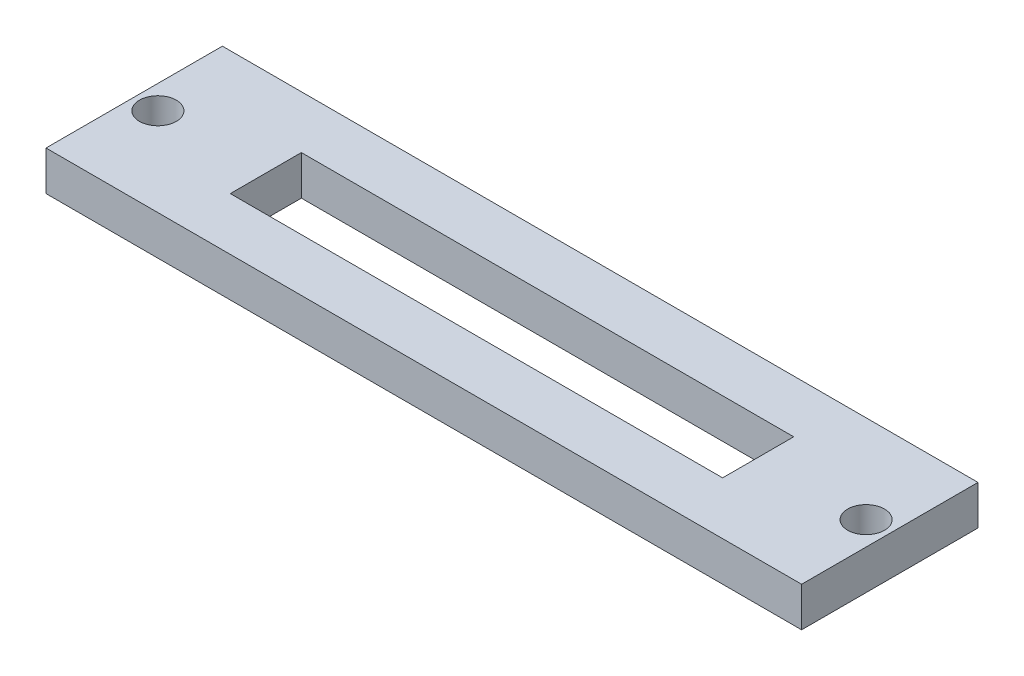
ISO-10303-21;
HEADER;
FILE_DESCRIPTION(('STEP AP214'),'2;1');
FILE_NAME('part.step','',(''),(''),'','','');
FILE_SCHEMA(('AUTOMOTIVE_DESIGN { 1 0 10303 214 1 1 1 1 }'));
ENDSEC;
DATA;
#1=APPLICATION_CONTEXT('core data for automotive mechanical design processes');
#2=APPLICATION_PROTOCOL_DEFINITION('international standard','automotive_design',2000,#1);
#3=PRODUCT_CONTEXT('',#1,'mechanical');
#4=PRODUCT('Part','Part','',(#3));
#5=PRODUCT_RELATED_PRODUCT_CATEGORY('part','',(#4));
#6=PRODUCT_DEFINITION_FORMATION('','',#4);
#7=PRODUCT_DEFINITION_CONTEXT('part definition',#1,'design');
#8=PRODUCT_DEFINITION('design','',#6,#7);
#9=PRODUCT_DEFINITION_SHAPE('','',#8);
#10=(LENGTH_UNIT() NAMED_UNIT(*) SI_UNIT(.MILLI.,.METRE.));
#11=(NAMED_UNIT(*) PLANE_ANGLE_UNIT() SI_UNIT($,.RADIAN.));
#12=(NAMED_UNIT(*) SI_UNIT($,.STERADIAN.) SOLID_ANGLE_UNIT());
#13=UNCERTAINTY_MEASURE_WITH_UNIT(LENGTH_MEASURE(1.E-05),#10,'distance_accuracy_value','');
#14=(GEOMETRIC_REPRESENTATION_CONTEXT(3) GLOBAL_UNCERTAINTY_ASSIGNED_CONTEXT((#13)) GLOBAL_UNIT_ASSIGNED_CONTEXT((#10,
#11,#12)) REPRESENTATION_CONTEXT('',''));
#15=CARTESIAN_POINT('',(0.,0.,0.));
#16=DIRECTION('',(0.,0.,1.));
#17=DIRECTION('',(1.,0.,0.));
#18=AXIS2_PLACEMENT_3D('',#15,#16,#17);
#19=CARTESIAN_POINT('',(0.,18.,0.));
#20=DIRECTION('',(0.,1.,0.));
#21=DIRECTION('',(0.,0.,1.));
#22=AXIS2_PLACEMENT_3D('',#19,#20,#21);
#23=PLANE('',#22);
#24=CARTESIAN_POINT('',(-26.9,18.,-24.6));
#25=DIRECTION('',(0.,1.,0.));
#26=DIRECTION('',(0.,0.,1.));
#27=AXIS2_PLACEMENT_3D('',#24,#25,#26);
#28=CIRCLE('',#27,1.4);
#29=CARTESIAN_POINT('',(-26.9,18.,-23.2));
#30=VERTEX_POINT('',#29);
#31=EDGE_CURVE('E131',#30,#30,#28,.T.);
#32=ORIENTED_EDGE('',*,*,#31,.F.);
#33=EDGE_LOOP('',(#32));
#34=FACE_BOUND('',#33,.T.);
#35=DIRECTION('',(0.,0.,1.));
#36=VECTOR('',#35,1.);
#37=CARTESIAN_POINT('',(-28.7,18.,-31.3));
#38=LINE('',#37,#36);
#39=CARTESIAN_POINT('',(-28.7,18.,-31.3));
#40=VERTEX_POINT('',#39);
#41=CARTESIAN_POINT('',(-28.7,18.,-17.9));
#42=VERTEX_POINT('',#41);
#43=EDGE_CURVE('E141',#40,#42,#38,.T.);
#44=ORIENTED_EDGE('',*,*,#43,.T.);
#45=DIRECTION('',(1.,0.,0.));
#46=VECTOR('',#45,1.);
#47=CARTESIAN_POINT('',(-28.7,18.,-17.9));
#48=LINE('',#47,#46);
#49=CARTESIAN_POINT('',(28.7,18.,-17.9));
#50=VERTEX_POINT('',#49);
#51=EDGE_CURVE('E144',#42,#50,#48,.T.);
#52=ORIENTED_EDGE('',*,*,#51,.T.);
#53=DIRECTION('',(0.,0.,-1.));
#54=VECTOR('',#53,1.);
#55=CARTESIAN_POINT('',(28.7,18.,-31.3));
#56=LINE('',#55,#54);
#57=CARTESIAN_POINT('',(28.7,18.,-31.3));
#58=VERTEX_POINT('',#57);
#59=EDGE_CURVE('E147',#50,#58,#56,.T.);
#60=ORIENTED_EDGE('',*,*,#59,.T.);
#61=DIRECTION('',(-1.,0.,0.));
#62=VECTOR('',#61,1.);
#63=CARTESIAN_POINT('',(-28.7,18.,-31.3));
#64=LINE('',#63,#62);
#65=EDGE_CURVE('E149',#58,#40,#64,.T.);
#66=ORIENTED_EDGE('',*,*,#65,.T.);
#67=EDGE_LOOP('',(#44,#52,#60,#66));
#68=FACE_BOUND('',#67,.T.);
#69=DIRECTION('',(1.,0.,0.));
#70=VECTOR('',#69,1.);
#71=CARTESIAN_POINT('',(-18.7,18.,-21.9));
#72=LINE('',#71,#70);
#73=CARTESIAN_POINT('',(-18.7,18.,-21.9));
#74=VERTEX_POINT('',#73);
#75=CARTESIAN_POINT('',(18.7,18.,-21.9));
#76=VERTEX_POINT('',#75);
#77=EDGE_CURVE('E110',#74,#76,#72,.T.);
#78=ORIENTED_EDGE('',*,*,#77,.F.);
#79=DIRECTION('',(0.,0.,1.));
#80=VECTOR('',#79,1.);
#81=CARTESIAN_POINT('',(-18.7,18.,-27.3));
#82=LINE('',#81,#80);
#83=CARTESIAN_POINT('',(-18.7,18.,-27.3));
#84=VERTEX_POINT('',#83);
#85=EDGE_CURVE('E102',#84,#74,#82,.T.);
#86=ORIENTED_EDGE('',*,*,#85,.F.);
#87=DIRECTION('',(-1.,0.,0.));
#88=VECTOR('',#87,1.);
#89=CARTESIAN_POINT('',(-18.7,18.,-27.3));
#90=LINE('',#89,#88);
#91=CARTESIAN_POINT('',(18.7,18.,-27.3));
#92=VERTEX_POINT('',#91);
#93=EDGE_CURVE('E125',#92,#84,#90,.T.);
#94=ORIENTED_EDGE('',*,*,#93,.F.);
#95=DIRECTION('',(0.,0.,-1.));
#96=VECTOR('',#95,1.);
#97=CARTESIAN_POINT('',(18.7,18.,-27.3));
#98=LINE('',#97,#96);
#99=EDGE_CURVE('E123',#76,#92,#98,.T.);
#100=ORIENTED_EDGE('',*,*,#99,.F.);
#101=EDGE_LOOP('',(#78,#86,#94,#100));
#102=FACE_BOUND('',#101,.T.);
#103=CARTESIAN_POINT('',(26.9,18.,-24.6));
#104=DIRECTION('',(0.,1.,0.));
#105=DIRECTION('',(0.,0.,1.));
#106=AXIS2_PLACEMENT_3D('',#103,#104,#105);
#107=CIRCLE('',#106,1.4);
#108=CARTESIAN_POINT('',(26.9,18.,-23.2));
#109=VERTEX_POINT('',#108);
#110=EDGE_CURVE('E231',#109,#109,#107,.T.);
#111=ORIENTED_EDGE('',*,*,#110,.F.);
#112=EDGE_LOOP('',(#111));
#113=FACE_BOUND('',#112,.T.);
#114=ADVANCED_FACE('F37',(#34,#68,#102,#113),#23,.T.);
#115=CARTESIAN_POINT('',(0.,15.,0.));
#116=DIRECTION('',(0.,1.,0.));
#117=DIRECTION('',(0.,0.,1.));
#118=AXIS2_PLACEMENT_3D('',#115,#116,#117);
#119=PLANE('',#118);
#120=DIRECTION('',(0.,0.,1.));
#121=VECTOR('',#120,1.);
#122=CARTESIAN_POINT('',(-28.7,15.,-31.3));
#123=LINE('',#122,#121);
#124=CARTESIAN_POINT('',(-28.7,15.,-31.3));
#125=VERTEX_POINT('',#124);
#126=CARTESIAN_POINT('',(-28.7,15.,-17.9));
#127=VERTEX_POINT('',#126);
#128=EDGE_CURVE('E118',#125,#127,#123,.T.);
#129=ORIENTED_EDGE('',*,*,#128,.F.);
#130=DIRECTION('',(-1.,0.,0.));
#131=VECTOR('',#130,1.);
#132=CARTESIAN_POINT('',(-28.7,15.,-31.3));
#133=LINE('',#132,#131);
#134=CARTESIAN_POINT('',(28.7,15.,-31.3));
#135=VERTEX_POINT('',#134);
#136=EDGE_CURVE('E145',#135,#125,#133,.T.);
#137=ORIENTED_EDGE('',*,*,#136,.F.);
#138=DIRECTION('',(0.,0.,-1.));
#139=VECTOR('',#138,1.);
#140=CARTESIAN_POINT('',(28.7,15.,-31.3));
#141=LINE('',#140,#139);
#142=CARTESIAN_POINT('',(28.7,15.,-17.9));
#143=VERTEX_POINT('',#142);
#144=EDGE_CURVE('E156',#143,#135,#141,.T.);
#145=ORIENTED_EDGE('',*,*,#144,.F.);
#146=DIRECTION('',(1.,0.,0.));
#147=VECTOR('',#146,1.);
#148=CARTESIAN_POINT('',(-28.7,15.,-17.9));
#149=LINE('',#148,#147);
#150=EDGE_CURVE('E154',#127,#143,#149,.T.);
#151=ORIENTED_EDGE('',*,*,#150,.F.);
#152=EDGE_LOOP('',(#129,#137,#145,#151));
#153=FACE_BOUND('',#152,.T.);
#154=DIRECTION('',(0.,0.,1.));
#155=VECTOR('',#154,1.);
#156=CARTESIAN_POINT('',(-18.7,15.,-27.3));
#157=LINE('',#156,#155);
#158=CARTESIAN_POINT('',(-18.7,15.,-27.3));
#159=VERTEX_POINT('',#158);
#160=CARTESIAN_POINT('',(-18.7,15.,-21.9));
#161=VERTEX_POINT('',#160);
#162=EDGE_CURVE('E60',#159,#161,#157,.T.);
#163=ORIENTED_EDGE('',*,*,#162,.T.);
#164=DIRECTION('',(1.,0.,0.));
#165=VECTOR('',#164,1.);
#166=CARTESIAN_POINT('',(-18.7,15.,-21.9));
#167=LINE('',#166,#165);
#168=CARTESIAN_POINT('',(18.7,15.,-21.9));
#169=VERTEX_POINT('',#168);
#170=EDGE_CURVE('E117',#161,#169,#167,.T.);
#171=ORIENTED_EDGE('',*,*,#170,.T.);
#172=DIRECTION('',(0.,0.,-1.));
#173=VECTOR('',#172,1.);
#174=CARTESIAN_POINT('',(18.7,15.,-27.3));
#175=LINE('',#174,#173);
#176=CARTESIAN_POINT('',(18.7,15.,-27.3));
#177=VERTEX_POINT('',#176);
#178=EDGE_CURVE('E133',#169,#177,#175,.T.);
#179=ORIENTED_EDGE('',*,*,#178,.T.);
#180=DIRECTION('',(-1.,0.,0.));
#181=VECTOR('',#180,1.);
#182=CARTESIAN_POINT('',(-18.7,15.,-27.3));
#183=LINE('',#182,#181);
#184=EDGE_CURVE('E111',#177,#159,#183,.T.);
#185=ORIENTED_EDGE('',*,*,#184,.T.);
#186=EDGE_LOOP('',(#163,#171,#179,#185));
#187=FACE_BOUND('',#186,.T.);
#188=CARTESIAN_POINT('',(-26.9,15.,-24.6));
#189=DIRECTION('',(0.,1.,0.));
#190=DIRECTION('',(0.,0.,1.));
#191=AXIS2_PLACEMENT_3D('',#188,#189,#190);
#192=CIRCLE('',#191,1.4);
#193=CARTESIAN_POINT('',(-26.9,15.,-23.2));
#194=VERTEX_POINT('',#193);
#195=EDGE_CURVE('E237',#194,#194,#192,.T.);
#196=ORIENTED_EDGE('',*,*,#195,.T.);
#197=EDGE_LOOP('',(#196));
#198=FACE_BOUND('',#197,.T.);
#199=CARTESIAN_POINT('',(26.9,15.,-24.6));
#200=DIRECTION('',(0.,1.,0.));
#201=DIRECTION('',(0.,0.,1.));
#202=AXIS2_PLACEMENT_3D('',#199,#200,#201);
#203=CIRCLE('',#202,1.4);
#204=CARTESIAN_POINT('',(26.9,15.,-23.2));
#205=VERTEX_POINT('',#204);
#206=EDGE_CURVE('E234',#205,#205,#203,.T.);
#207=ORIENTED_EDGE('',*,*,#206,.T.);
#208=EDGE_LOOP('',(#207));
#209=FACE_BOUND('',#208,.T.);
#210=ADVANCED_FACE('F174',(#153,#187,#198,#209),#119,.F.);
#211=CARTESIAN_POINT('',(-28.7,18.,-31.3));
#212=DIRECTION('',(1.,0.,0.));
#213=DIRECTION('',(0.,0.,-1.));
#214=AXIS2_PLACEMENT_3D('',#211,#212,#213);
#215=PLANE('',#214);
#216=ORIENTED_EDGE('',*,*,#128,.T.);
#217=DIRECTION('',(0.,-1.,0.));
#218=VECTOR('',#217,1.);
#219=CARTESIAN_POINT('',(-28.7,18.,-17.9));
#220=LINE('',#219,#218);
#221=EDGE_CURVE('E11',#42,#127,#220,.T.);
#222=ORIENTED_EDGE('',*,*,#221,.F.);
#223=ORIENTED_EDGE('',*,*,#43,.F.);
#224=DIRECTION('',(0.,-1.,0.));
#225=VECTOR('',#224,1.);
#226=CARTESIAN_POINT('',(-28.7,18.,-31.3));
#227=LINE('',#226,#225);
#228=EDGE_CURVE('E151',#40,#125,#227,.T.);
#229=ORIENTED_EDGE('',*,*,#228,.T.);
#230=EDGE_LOOP('',(#216,#222,#223,#229));
#231=FACE_BOUND('',#230,.T.);
#232=ADVANCED_FACE('F39',(#231),#215,.F.);
#233=CARTESIAN_POINT('',(-28.7,18.,-17.9));
#234=DIRECTION('',(0.,0.,-1.));
#235=DIRECTION('',(-1.,0.,0.));
#236=AXIS2_PLACEMENT_3D('',#233,#234,#235);
#237=PLANE('',#236);
#238=ORIENTED_EDGE('',*,*,#150,.T.);
#239=DIRECTION('',(0.,-1.,0.));
#240=VECTOR('',#239,1.);
#241=CARTESIAN_POINT('',(28.7,18.,-17.9));
#242=LINE('',#241,#240);
#243=EDGE_CURVE('E45',#50,#143,#242,.T.);
#244=ORIENTED_EDGE('',*,*,#243,.F.);
#245=ORIENTED_EDGE('',*,*,#51,.F.);
#246=ORIENTED_EDGE('',*,*,#221,.T.);
#247=EDGE_LOOP('',(#238,#244,#245,#246));
#248=FACE_BOUND('',#247,.T.);
#249=ADVANCED_FACE('F184',(#248),#237,.F.);
#250=CARTESIAN_POINT('',(28.7,18.,-31.3));
#251=DIRECTION('',(-1.,0.,0.));
#252=DIRECTION('',(0.,0.,1.));
#253=AXIS2_PLACEMENT_3D('',#250,#251,#252);
#254=PLANE('',#253);
#255=ORIENTED_EDGE('',*,*,#144,.T.);
#256=DIRECTION('',(0.,-1.,0.));
#257=VECTOR('',#256,1.);
#258=CARTESIAN_POINT('',(28.7,18.,-31.3));
#259=LINE('',#258,#257);
#260=EDGE_CURVE('E161',#58,#135,#259,.T.);
#261=ORIENTED_EDGE('',*,*,#260,.F.);
#262=ORIENTED_EDGE('',*,*,#59,.F.);
#263=ORIENTED_EDGE('',*,*,#243,.T.);
#264=EDGE_LOOP('',(#255,#261,#262,#263));
#265=FACE_BOUND('',#264,.T.);
#266=ADVANCED_FACE('F168',(#265),#254,.F.);
#267=CARTESIAN_POINT('',(-28.7,18.,-31.3));
#268=DIRECTION('',(0.,0.,1.));
#269=DIRECTION('',(1.,0.,0.));
#270=AXIS2_PLACEMENT_3D('',#267,#268,#269);
#271=PLANE('',#270);
#272=ORIENTED_EDGE('',*,*,#136,.T.);
#273=ORIENTED_EDGE('',*,*,#228,.F.);
#274=ORIENTED_EDGE('',*,*,#65,.F.);
#275=ORIENTED_EDGE('',*,*,#260,.T.);
#276=EDGE_LOOP('',(#272,#273,#274,#275));
#277=FACE_BOUND('',#276,.T.);
#278=ADVANCED_FACE('F178',(#277),#271,.F.);
#279=CARTESIAN_POINT('',(-18.7,18.,-27.3));
#280=DIRECTION('',(1.,0.,0.));
#281=DIRECTION('',(0.,0.,-1.));
#282=AXIS2_PLACEMENT_3D('',#279,#280,#281);
#283=PLANE('',#282);
#284=ORIENTED_EDGE('',*,*,#162,.F.);
#285=DIRECTION('',(0.,-1.,0.));
#286=VECTOR('',#285,1.);
#287=CARTESIAN_POINT('',(-18.7,18.,-27.3));
#288=LINE('',#287,#286);
#289=EDGE_CURVE('E106',#84,#159,#288,.T.);
#290=ORIENTED_EDGE('',*,*,#289,.F.);
#291=ORIENTED_EDGE('',*,*,#85,.T.);
#292=DIRECTION('',(0.,-1.,0.));
#293=VECTOR('',#292,1.);
#294=CARTESIAN_POINT('',(-18.7,18.,-21.9));
#295=LINE('',#294,#293);
#296=EDGE_CURVE('E105',#74,#161,#295,.T.);
#297=ORIENTED_EDGE('',*,*,#296,.T.);
#298=EDGE_LOOP('',(#284,#290,#291,#297));
#299=FACE_BOUND('',#298,.T.);
#300=ADVANCED_FACE('F104',(#299),#283,.T.);
#301=CARTESIAN_POINT('',(-18.7,18.,-21.9));
#302=DIRECTION('',(0.,0.,-1.));
#303=DIRECTION('',(-1.,0.,0.));
#304=AXIS2_PLACEMENT_3D('',#301,#302,#303);
#305=PLANE('',#304);
#306=ORIENTED_EDGE('',*,*,#170,.F.);
#307=ORIENTED_EDGE('',*,*,#296,.F.);
#308=ORIENTED_EDGE('',*,*,#77,.T.);
#309=DIRECTION('',(0.,-1.,0.));
#310=VECTOR('',#309,1.);
#311=CARTESIAN_POINT('',(18.7,18.,-21.9));
#312=LINE('',#311,#310);
#313=EDGE_CURVE('E119',#76,#169,#312,.T.);
#314=ORIENTED_EDGE('',*,*,#313,.T.);
#315=EDGE_LOOP('',(#306,#307,#308,#314));
#316=FACE_BOUND('',#315,.T.);
#317=ADVANCED_FACE('F114',(#316),#305,.T.);
#318=CARTESIAN_POINT('',(18.7,18.,-27.3));
#319=DIRECTION('',(-1.,0.,0.));
#320=DIRECTION('',(0.,0.,1.));
#321=AXIS2_PLACEMENT_3D('',#318,#319,#320);
#322=PLANE('',#321);
#323=ORIENTED_EDGE('',*,*,#178,.F.);
#324=ORIENTED_EDGE('',*,*,#313,.F.);
#325=ORIENTED_EDGE('',*,*,#99,.T.);
#326=DIRECTION('',(0.,-1.,0.));
#327=VECTOR('',#326,1.);
#328=CARTESIAN_POINT('',(18.7,18.,-27.3));
#329=LINE('',#328,#327);
#330=EDGE_CURVE('E52',#92,#177,#329,.T.);
#331=ORIENTED_EDGE('',*,*,#330,.T.);
#332=EDGE_LOOP('',(#323,#324,#325,#331));
#333=FACE_BOUND('',#332,.T.);
#334=ADVANCED_FACE('F209',(#333),#322,.T.);
#335=CARTESIAN_POINT('',(-18.7,18.,-27.3));
#336=DIRECTION('',(0.,0.,1.));
#337=DIRECTION('',(1.,0.,0.));
#338=AXIS2_PLACEMENT_3D('',#335,#336,#337);
#339=PLANE('',#338);
#340=ORIENTED_EDGE('',*,*,#184,.F.);
#341=ORIENTED_EDGE('',*,*,#330,.F.);
#342=ORIENTED_EDGE('',*,*,#93,.T.);
#343=ORIENTED_EDGE('',*,*,#289,.T.);
#344=EDGE_LOOP('',(#340,#341,#342,#343));
#345=FACE_BOUND('',#344,.T.);
#346=ADVANCED_FACE('F213',(#345),#339,.T.);
#347=CARTESIAN_POINT('',(-26.9,18.,-24.6));
#348=DIRECTION('',(0.,-1.,0.));
#349=DIRECTION('',(0.,0.,-1.));
#350=AXIS2_PLACEMENT_3D('',#347,#348,#349);
#351=CYLINDRICAL_SURFACE('',#350,1.4);
#352=ORIENTED_EDGE('',*,*,#31,.T.);
#353=EDGE_LOOP('',(#352));
#354=FACE_BOUND('',#353,.T.);
#355=ORIENTED_EDGE('',*,*,#195,.F.);
#356=EDGE_LOOP('',(#355));
#357=FACE_BOUND('',#356,.T.);
#358=ADVANCED_FACE('F219',(#354,#357),#351,.F.);
#359=CARTESIAN_POINT('',(26.9,18.,-24.6));
#360=DIRECTION('',(0.,-1.,0.));
#361=DIRECTION('',(0.,0.,-1.));
#362=AXIS2_PLACEMENT_3D('',#359,#360,#361);
#363=CYLINDRICAL_SURFACE('',#362,1.4);
#364=ORIENTED_EDGE('',*,*,#110,.T.);
#365=EDGE_LOOP('',(#364));
#366=FACE_BOUND('',#365,.T.);
#367=ORIENTED_EDGE('',*,*,#206,.F.);
#368=EDGE_LOOP('',(#367));
#369=FACE_BOUND('',#368,.T.);
#370=ADVANCED_FACE('F222',(#366,#369),#363,.F.);
#371=CLOSED_SHELL('',(#114,#210,#232,#249,#266,#278,#300,#317,#334,#346,#358,#370));
#372=MANIFOLD_SOLID_BREP('B2',#371);
#373=ADVANCED_BREP_SHAPE_REPRESENTATION('',(#18,#372),#14);
#374=SHAPE_DEFINITION_REPRESENTATION(#9,#373);
ENDSEC;
END-ISO-10303-21;
